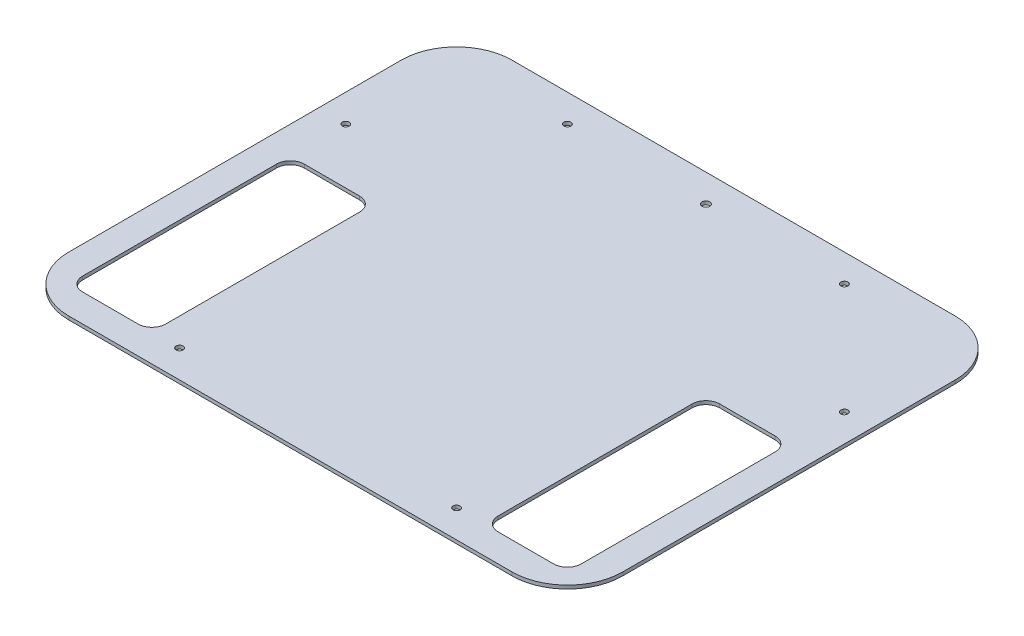
ISO-10303-21;
HEADER;
FILE_DESCRIPTION(('STEP AP214'),'2;1');
FILE_NAME('part.step','',(''),(''),'','','');
FILE_SCHEMA(('AUTOMOTIVE_DESIGN { 1 0 10303 214 1 1 1 1 }'));
ENDSEC;
DATA;
#1=APPLICATION_CONTEXT('core data for automotive mechanical design processes');
#2=APPLICATION_PROTOCOL_DEFINITION('international standard','automotive_design',2000,#1);
#3=PRODUCT_CONTEXT('',#1,'mechanical');
#4=PRODUCT('Part','Part','',(#3));
#5=PRODUCT_RELATED_PRODUCT_CATEGORY('part','',(#4));
#6=PRODUCT_DEFINITION_FORMATION('','',#4);
#7=PRODUCT_DEFINITION_CONTEXT('part definition',#1,'design');
#8=PRODUCT_DEFINITION('design','',#6,#7);
#9=PRODUCT_DEFINITION_SHAPE('','',#8);
#10=(LENGTH_UNIT() NAMED_UNIT(*) SI_UNIT(.MILLI.,.METRE.));
#11=(NAMED_UNIT(*) PLANE_ANGLE_UNIT() SI_UNIT($,.RADIAN.));
#12=(NAMED_UNIT(*) SI_UNIT($,.STERADIAN.) SOLID_ANGLE_UNIT());
#13=UNCERTAINTY_MEASURE_WITH_UNIT(LENGTH_MEASURE(1.E-05),#10,'distance_accuracy_value','');
#14=(GEOMETRIC_REPRESENTATION_CONTEXT(3) GLOBAL_UNCERTAINTY_ASSIGNED_CONTEXT((#13)) GLOBAL_UNIT_ASSIGNED_CONTEXT((#10,
#11,#12)) REPRESENTATION_CONTEXT('',''));
#15=CARTESIAN_POINT('',(0.,0.,0.));
#16=DIRECTION('',(0.,0.,1.));
#17=DIRECTION('',(1.,0.,0.));
#18=AXIS2_PLACEMENT_3D('',#15,#16,#17);
#19=CARTESIAN_POINT('',(-254.,3.175,-203.2));
#20=DIRECTION('',(1.,0.,0.));
#21=DIRECTION('',(0.,0.,-1.));
#22=AXIS2_PLACEMENT_3D('',#19,#20,#21);
#23=PLANE('',#22);
#24=DIRECTION('',(0.,0.,1.));
#25=VECTOR('',#24,1.);
#26=CARTESIAN_POINT('',(-254.,3.175,-203.2));
#27=LINE('',#26,#25);
#28=CARTESIAN_POINT('',(-254.,3.175,-152.4));
#29=VERTEX_POINT('',#28);
#30=CARTESIAN_POINT('',(-254.,3.175,152.4));
#31=VERTEX_POINT('',#30);
#32=EDGE_CURVE('E218',#29,#31,#27,.T.);
#33=ORIENTED_EDGE('',*,*,#32,.F.);
#34=DIRECTION('',(0.,-1.,0.));
#35=VECTOR('',#34,1.);
#36=CARTESIAN_POINT('',(-254.,3.175,-152.4));
#37=LINE('',#36,#35);
#38=CARTESIAN_POINT('',(-254.,0.,-152.4));
#39=VERTEX_POINT('',#38);
#40=EDGE_CURVE('E203',#29,#39,#37,.T.);
#41=ORIENTED_EDGE('',*,*,#40,.T.);
#42=DIRECTION('',(0.,0.,1.));
#43=VECTOR('',#42,1.);
#44=CARTESIAN_POINT('',(-254.,0.,-203.2));
#45=LINE('',#44,#43);
#46=CARTESIAN_POINT('',(-254.,0.,152.4));
#47=VERTEX_POINT('',#46);
#48=EDGE_CURVE('E215',#39,#47,#45,.T.);
#49=ORIENTED_EDGE('',*,*,#48,.T.);
#50=DIRECTION('',(0.,-1.,0.));
#51=VECTOR('',#50,1.);
#52=CARTESIAN_POINT('',(-254.,3.175,152.4));
#53=LINE('',#52,#51);
#54=EDGE_CURVE('E220',#47,#31,#53,.F.);
#55=ORIENTED_EDGE('',*,*,#54,.T.);
#56=EDGE_LOOP('',(#33,#41,#49,#55));
#57=FACE_BOUND('',#56,.T.);
#58=ADVANCED_FACE('F35',(#57),#23,.F.);
#59=CARTESIAN_POINT('',(-254.,3.175,203.2));
#60=DIRECTION('',(0.,0.,-1.));
#61=DIRECTION('',(-1.,0.,0.));
#62=AXIS2_PLACEMENT_3D('',#59,#60,#61);
#63=PLANE('',#62);
#64=DIRECTION('',(1.,0.,0.));
#65=VECTOR('',#64,1.);
#66=CARTESIAN_POINT('',(-254.,0.,203.2));
#67=LINE('',#66,#65);
#68=CARTESIAN_POINT('',(-203.2,0.,203.2));
#69=VERTEX_POINT('',#68);
#70=CARTESIAN_POINT('',(203.2,0.,203.2));
#71=VERTEX_POINT('',#70);
#72=EDGE_CURVE('E224',#69,#71,#67,.T.);
#73=ORIENTED_EDGE('',*,*,#72,.T.);
#74=DIRECTION('',(0.,-1.,0.));
#75=VECTOR('',#74,1.);
#76=CARTESIAN_POINT('',(203.2,3.175,203.2));
#77=LINE('',#76,#75);
#78=CARTESIAN_POINT('',(203.2,3.175,203.2));
#79=VERTEX_POINT('',#78);
#80=EDGE_CURVE('E265',#71,#79,#77,.F.);
#81=ORIENTED_EDGE('',*,*,#80,.T.);
#82=DIRECTION('',(1.,0.,0.));
#83=VECTOR('',#82,1.);
#84=CARTESIAN_POINT('',(-254.,3.175,203.2));
#85=LINE('',#84,#83);
#86=CARTESIAN_POINT('',(-203.2,3.175,203.2));
#87=VERTEX_POINT('',#86);
#88=EDGE_CURVE('E396',#87,#79,#85,.T.);
#89=ORIENTED_EDGE('',*,*,#88,.F.);
#90=DIRECTION('',(0.,-1.,0.));
#91=VECTOR('',#90,1.);
#92=CARTESIAN_POINT('',(-203.2,3.175,203.2));
#93=LINE('',#92,#91);
#94=EDGE_CURVE('E262',#87,#69,#93,.T.);
#95=ORIENTED_EDGE('',*,*,#94,.T.);
#96=EDGE_LOOP('',(#73,#81,#89,#95));
#97=FACE_BOUND('',#96,.T.);
#98=ADVANCED_FACE('F421',(#97),#63,.F.);
#99=CARTESIAN_POINT('',(254.,3.175,-203.2));
#100=DIRECTION('',(-1.,0.,0.));
#101=DIRECTION('',(0.,0.,1.));
#102=AXIS2_PLACEMENT_3D('',#99,#100,#101);
#103=PLANE('',#102);
#104=DIRECTION('',(0.,0.,-1.));
#105=VECTOR('',#104,1.);
#106=CARTESIAN_POINT('',(254.,0.,-203.2));
#107=LINE('',#106,#105);
#108=CARTESIAN_POINT('',(254.,0.,152.4));
#109=VERTEX_POINT('',#108);
#110=CARTESIAN_POINT('',(254.,0.,-152.4));
#111=VERTEX_POINT('',#110);
#112=EDGE_CURVE('E228',#109,#111,#107,.T.);
#113=ORIENTED_EDGE('',*,*,#112,.T.);
#114=DIRECTION('',(0.,-1.,0.));
#115=VECTOR('',#114,1.);
#116=CARTESIAN_POINT('',(254.,3.175,-152.4));
#117=LINE('',#116,#115);
#118=CARTESIAN_POINT('',(254.,3.175,-152.4));
#119=VERTEX_POINT('',#118);
#120=EDGE_CURVE('E260',#111,#119,#117,.F.);
#121=ORIENTED_EDGE('',*,*,#120,.T.);
#122=DIRECTION('',(0.,0.,-1.));
#123=VECTOR('',#122,1.);
#124=CARTESIAN_POINT('',(254.,3.175,-203.2));
#125=LINE('',#124,#123);
#126=CARTESIAN_POINT('',(254.,3.175,152.4));
#127=VERTEX_POINT('',#126);
#128=EDGE_CURVE('E398',#127,#119,#125,.T.);
#129=ORIENTED_EDGE('',*,*,#128,.F.);
#130=DIRECTION('',(0.,-1.,0.));
#131=VECTOR('',#130,1.);
#132=CARTESIAN_POINT('',(254.,3.175,152.4));
#133=LINE('',#132,#131);
#134=EDGE_CURVE('E257',#127,#109,#133,.T.);
#135=ORIENTED_EDGE('',*,*,#134,.T.);
#136=EDGE_LOOP('',(#113,#121,#129,#135));
#137=FACE_BOUND('',#136,.T.);
#138=ADVANCED_FACE('F414',(#137),#103,.F.);
#139=CARTESIAN_POINT('',(-254.,3.175,-203.2));
#140=DIRECTION('',(0.,0.,1.));
#141=DIRECTION('',(1.,0.,0.));
#142=AXIS2_PLACEMENT_3D('',#139,#140,#141);
#143=PLANE('',#142);
#144=DIRECTION('',(-1.,0.,0.));
#145=VECTOR('',#144,1.);
#146=CARTESIAN_POINT('',(-254.,0.,-203.2));
#147=LINE('',#146,#145);
#148=CARTESIAN_POINT('',(203.2,0.,-203.2));
#149=VERTEX_POINT('',#148);
#150=CARTESIAN_POINT('',(-203.2,0.,-203.2));
#151=VERTEX_POINT('',#150);
#152=EDGE_CURVE('E239',#149,#151,#147,.T.);
#153=ORIENTED_EDGE('',*,*,#152,.T.);
#154=DIRECTION('',(0.,-1.,0.));
#155=VECTOR('',#154,1.);
#156=CARTESIAN_POINT('',(-203.2,3.175,-203.2));
#157=LINE('',#156,#155);
#158=CARTESIAN_POINT('',(-203.2,3.175,-203.2));
#159=VERTEX_POINT('',#158);
#160=EDGE_CURVE('E204',#151,#159,#157,.F.);
#161=ORIENTED_EDGE('',*,*,#160,.T.);
#162=DIRECTION('',(-1.,0.,0.));
#163=VECTOR('',#162,1.);
#164=CARTESIAN_POINT('',(-254.,3.175,-203.2));
#165=LINE('',#164,#163);
#166=CARTESIAN_POINT('',(203.2,3.175,-203.2));
#167=VERTEX_POINT('',#166);
#168=EDGE_CURVE('E234',#167,#159,#165,.T.);
#169=ORIENTED_EDGE('',*,*,#168,.F.);
#170=DIRECTION('',(0.,-1.,0.));
#171=VECTOR('',#170,1.);
#172=CARTESIAN_POINT('',(203.2,3.175,-203.2));
#173=LINE('',#172,#171);
#174=EDGE_CURVE('E209',#167,#149,#173,.T.);
#175=ORIENTED_EDGE('',*,*,#174,.T.);
#176=EDGE_LOOP('',(#153,#161,#169,#175));
#177=FACE_BOUND('',#176,.T.);
#178=ADVANCED_FACE('F408',(#177),#143,.F.);
#179=CARTESIAN_POINT('',(-254.,3.175,203.2));
#180=DIRECTION('',(0.,1.,0.));
#181=DIRECTION('',(0.,0.,1.));
#182=AXIS2_PLACEMENT_3D('',#179,#180,#181);
#183=PLANE('',#182);
#184=CARTESIAN_POINT('',(0.,3.175,-177.8));
#185=DIRECTION('',(0.,1.,0.));
#186=DIRECTION('',(0.,0.,1.));
#187=AXIS2_PLACEMENT_3D('',#184,#185,#186);
#188=CIRCLE('',#187,3.57844786961746);
#189=CARTESIAN_POINT('',(0.,3.175,-174.221552130383));
#190=VERTEX_POINT('',#189);
#191=EDGE_CURVE('E737',#190,#190,#188,.T.);
#192=ORIENTED_EDGE('',*,*,#191,.F.);
#193=EDGE_LOOP('',(#192));
#194=FACE_BOUND('',#193,.T.);
#195=CARTESIAN_POINT('',(-127.,3.175,-177.8));
#196=DIRECTION('',(0.,1.,0.));
#197=DIRECTION('',(0.,0.,1.));
#198=AXIS2_PLACEMENT_3D('',#195,#196,#197);
#199=CIRCLE('',#198,3.175);
#200=CARTESIAN_POINT('',(-127.,3.175,-174.625));
#201=VERTEX_POINT('',#200);
#202=EDGE_CURVE('E741',#201,#201,#199,.T.);
#203=ORIENTED_EDGE('',*,*,#202,.F.);
#204=EDGE_LOOP('',(#203));
#205=FACE_BOUND('',#204,.T.);
#206=CARTESIAN_POINT('',(127.,3.175,-177.8));
#207=DIRECTION('',(0.,1.,0.));
#208=DIRECTION('',(0.,0.,1.));
#209=AXIS2_PLACEMENT_3D('',#206,#207,#208);
#210=CIRCLE('',#209,3.17499999999998);
#211=CARTESIAN_POINT('',(127.,3.175,-174.625));
#212=VERTEX_POINT('',#211);
#213=EDGE_CURVE('E750',#212,#212,#210,.T.);
#214=ORIENTED_EDGE('',*,*,#213,.F.);
#215=EDGE_LOOP('',(#214));
#216=FACE_BOUND('',#215,.T.);
#217=CARTESIAN_POINT('',(228.6,3.175,-76.2));
#218=DIRECTION('',(0.,1.,0.));
#219=DIRECTION('',(0.,0.,1.));
#220=AXIS2_PLACEMENT_3D('',#217,#218,#219);
#221=CIRCLE('',#220,3.17499999999998);
#222=CARTESIAN_POINT('',(228.6,3.175,-73.025));
#223=VERTEX_POINT('',#222);
#224=EDGE_CURVE('E753',#223,#223,#221,.T.);
#225=ORIENTED_EDGE('',*,*,#224,.F.);
#226=EDGE_LOOP('',(#225));
#227=FACE_BOUND('',#226,.T.);
#228=CARTESIAN_POINT('',(-228.6,3.175,-76.2));
#229=DIRECTION('',(0.,1.,0.));
#230=DIRECTION('',(0.,0.,1.));
#231=AXIS2_PLACEMENT_3D('',#228,#229,#230);
#232=CIRCLE('',#231,3.17499999999998);
#233=CARTESIAN_POINT('',(-228.6,3.175,-73.025));
#234=VERTEX_POINT('',#233);
#235=EDGE_CURVE('E351',#234,#234,#232,.T.);
#236=ORIENTED_EDGE('',*,*,#235,.F.);
#237=EDGE_LOOP('',(#236));
#238=FACE_BOUND('',#237,.T.);
#239=CARTESIAN_POINT('',(-127.,3.175,177.8));
#240=DIRECTION('',(0.,1.,0.));
#241=DIRECTION('',(0.,0.,1.));
#242=AXIS2_PLACEMENT_3D('',#239,#240,#241);
#243=CIRCLE('',#242,3.175);
#244=CARTESIAN_POINT('',(-127.,3.175,180.975));
#245=VERTEX_POINT('',#244);
#246=EDGE_CURVE('E340',#245,#245,#243,.T.);
#247=ORIENTED_EDGE('',*,*,#246,.F.);
#248=EDGE_LOOP('',(#247));
#249=FACE_BOUND('',#248,.T.);
#250=CARTESIAN_POINT('',(127.,3.175,177.8));
#251=DIRECTION('',(0.,1.,0.));
#252=DIRECTION('',(0.,0.,1.));
#253=AXIS2_PLACEMENT_3D('',#250,#251,#252);
#254=CIRCLE('',#253,3.17499999999998);
#255=CARTESIAN_POINT('',(127.,3.175,180.975));
#256=VERTEX_POINT('',#255);
#257=EDGE_CURVE('E337',#256,#256,#254,.T.);
#258=ORIENTED_EDGE('',*,*,#257,.F.);
#259=EDGE_LOOP('',(#258));
#260=FACE_BOUND('',#259,.T.);
#261=DIRECTION('',(0.,0.,1.));
#262=VECTOR('',#261,1.);
#263=CARTESIAN_POINT('',(152.4,3.175,177.8));
#264=LINE('',#263,#262);
#265=CARTESIAN_POINT('',(152.4,3.175,-12.7));
#266=VERTEX_POINT('',#265);
#267=CARTESIAN_POINT('',(152.4,3.175,165.1));
#268=VERTEX_POINT('',#267);
#269=EDGE_CURVE('E336',#266,#268,#264,.T.);
#270=ORIENTED_EDGE('',*,*,#269,.F.);
#271=CARTESIAN_POINT('',(165.1,3.175,-12.7));
#272=DIRECTION('',(0.,1.,0.));
#273=DIRECTION('',(0.,0.,1.));
#274=AXIS2_PLACEMENT_3D('',#271,#272,#273);
#275=CIRCLE('',#274,12.7);
#276=CARTESIAN_POINT('',(165.1,3.175,-25.4));
#277=VERTEX_POINT('',#276);
#278=EDGE_CURVE('E326',#266,#277,#275,.F.);
#279=ORIENTED_EDGE('',*,*,#278,.T.);
#280=DIRECTION('',(-1.,0.,0.));
#281=VECTOR('',#280,1.);
#282=CARTESIAN_POINT('',(152.4,3.175,-25.4));
#283=LINE('',#282,#281);
#284=CARTESIAN_POINT('',(215.9,3.175,-25.4));
#285=VERTEX_POINT('',#284);
#286=EDGE_CURVE('E358',#285,#277,#283,.T.);
#287=ORIENTED_EDGE('',*,*,#286,.F.);
#288=CARTESIAN_POINT('',(215.9,3.175,-12.7));
#289=DIRECTION('',(0.,1.,0.));
#290=DIRECTION('',(0.,0.,1.));
#291=AXIS2_PLACEMENT_3D('',#288,#289,#290);
#292=CIRCLE('',#291,12.7);
#293=CARTESIAN_POINT('',(228.6,3.175,-12.7));
#294=VERTEX_POINT('',#293);
#295=EDGE_CURVE('E322',#285,#294,#292,.F.);
#296=ORIENTED_EDGE('',*,*,#295,.T.);
#297=DIRECTION('',(0.,0.,-1.));
#298=VECTOR('',#297,1.);
#299=CARTESIAN_POINT('',(228.6,3.175,177.8));
#300=LINE('',#299,#298);
#301=CARTESIAN_POINT('',(228.6,3.175,165.1));
#302=VERTEX_POINT('',#301);
#303=EDGE_CURVE('E371',#302,#294,#300,.T.);
#304=ORIENTED_EDGE('',*,*,#303,.F.);
#305=CARTESIAN_POINT('',(215.9,3.175,165.1));
#306=DIRECTION('',(0.,1.,0.));
#307=DIRECTION('',(0.,0.,1.));
#308=AXIS2_PLACEMENT_3D('',#305,#306,#307);
#309=CIRCLE('',#308,12.7);
#310=CARTESIAN_POINT('',(215.9,3.175,177.8));
#311=VERTEX_POINT('',#310);
#312=EDGE_CURVE('E44',#302,#311,#309,.F.);
#313=ORIENTED_EDGE('',*,*,#312,.T.);
#314=DIRECTION('',(1.,0.,0.));
#315=VECTOR('',#314,1.);
#316=CARTESIAN_POINT('',(152.4,3.175,177.8));
#317=LINE('',#316,#315);
#318=CARTESIAN_POINT('',(165.1,3.175,177.8));
#319=VERTEX_POINT('',#318);
#320=EDGE_CURVE('E369',#319,#311,#317,.T.);
#321=ORIENTED_EDGE('',*,*,#320,.F.);
#322=CARTESIAN_POINT('',(165.1,3.175,165.1));
#323=DIRECTION('',(0.,1.,0.));
#324=DIRECTION('',(0.,0.,1.));
#325=AXIS2_PLACEMENT_3D('',#322,#323,#324);
#326=CIRCLE('',#325,12.7);
#327=EDGE_CURVE('E330',#319,#268,#326,.F.);
#328=ORIENTED_EDGE('',*,*,#327,.T.);
#329=EDGE_LOOP('',(#270,#279,#287,#296,#304,#313,#321,#328));
#330=FACE_BOUND('',#329,.T.);
#331=DIRECTION('',(0.,0.,1.));
#332=VECTOR('',#331,1.);
#333=CARTESIAN_POINT('',(-228.6,3.175,177.8));
#334=LINE('',#333,#332);
#335=CARTESIAN_POINT('',(-228.6,3.175,-12.7));
#336=VERTEX_POINT('',#335);
#337=CARTESIAN_POINT('',(-228.6,3.175,165.1));
#338=VERTEX_POINT('',#337);
#339=EDGE_CURVE('E366',#336,#338,#334,.T.);
#340=ORIENTED_EDGE('',*,*,#339,.F.);
#341=CARTESIAN_POINT('',(-215.9,3.175,-12.7));
#342=DIRECTION('',(0.,1.,0.));
#343=DIRECTION('',(0.,0.,1.));
#344=AXIS2_PLACEMENT_3D('',#341,#342,#343);
#345=CIRCLE('',#344,12.7);
#346=CARTESIAN_POINT('',(-215.9,3.175,-25.4));
#347=VERTEX_POINT('',#346);
#348=EDGE_CURVE('E310',#336,#347,#345,.F.);
#349=ORIENTED_EDGE('',*,*,#348,.T.);
#350=DIRECTION('',(-1.,0.,0.));
#351=VECTOR('',#350,1.);
#352=CARTESIAN_POINT('',(-228.6,3.175,-25.4));
#353=LINE('',#352,#351);
#354=CARTESIAN_POINT('',(-165.1,3.175,-25.4));
#355=VERTEX_POINT('',#354);
#356=EDGE_CURVE('E380',#355,#347,#353,.T.);
#357=ORIENTED_EDGE('',*,*,#356,.F.);
#358=CARTESIAN_POINT('',(-165.1,3.175,-12.7));
#359=DIRECTION('',(0.,1.,0.));
#360=DIRECTION('',(0.,0.,1.));
#361=AXIS2_PLACEMENT_3D('',#358,#359,#360);
#362=CIRCLE('',#361,12.7);
#363=CARTESIAN_POINT('',(-152.4,3.175,-12.7));
#364=VERTEX_POINT('',#363);
#365=EDGE_CURVE('E306',#355,#364,#362,.F.);
#366=ORIENTED_EDGE('',*,*,#365,.T.);
#367=DIRECTION('',(0.,0.,-1.));
#368=VECTOR('',#367,1.);
#369=CARTESIAN_POINT('',(-152.4,3.175,177.8));
#370=LINE('',#369,#368);
#371=CARTESIAN_POINT('',(-152.4,3.175,165.1));
#372=VERTEX_POINT('',#371);
#373=EDGE_CURVE('E390',#372,#364,#370,.T.);
#374=ORIENTED_EDGE('',*,*,#373,.F.);
#375=CARTESIAN_POINT('',(-165.1,3.175,165.1));
#376=DIRECTION('',(0.,1.,0.));
#377=DIRECTION('',(0.,0.,1.));
#378=AXIS2_PLACEMENT_3D('',#375,#376,#377);
#379=CIRCLE('',#378,12.7);
#380=CARTESIAN_POINT('',(-165.1,3.175,177.8));
#381=VERTEX_POINT('',#380);
#382=EDGE_CURVE('E314',#372,#381,#379,.F.);
#383=ORIENTED_EDGE('',*,*,#382,.T.);
#384=DIRECTION('',(1.,0.,0.));
#385=VECTOR('',#384,1.);
#386=CARTESIAN_POINT('',(-228.6,3.175,177.8));
#387=LINE('',#386,#385);
#388=CARTESIAN_POINT('',(-215.9,3.175,177.8));
#389=VERTEX_POINT('',#388);
#390=EDGE_CURVE('E387',#389,#381,#387,.T.);
#391=ORIENTED_EDGE('',*,*,#390,.F.);
#392=CARTESIAN_POINT('',(-215.9,3.175,165.1));
#393=DIRECTION('',(0.,1.,0.));
#394=DIRECTION('',(0.,0.,1.));
#395=AXIS2_PLACEMENT_3D('',#392,#393,#394);
#396=CIRCLE('',#395,12.7);
#397=EDGE_CURVE('E318',#389,#338,#396,.F.);
#398=ORIENTED_EDGE('',*,*,#397,.T.);
#399=EDGE_LOOP('',(#340,#349,#357,#366,#374,#383,#391,#398));
#400=FACE_BOUND('',#399,.T.);
#401=ORIENTED_EDGE('',*,*,#168,.T.);
#402=CARTESIAN_POINT('',(-203.2,3.175,-152.4));
#403=DIRECTION('',(0.,1.,0.));
#404=DIRECTION('',(0.,0.,1.));
#405=AXIS2_PLACEMENT_3D('',#402,#403,#404);
#406=CIRCLE('',#405,50.8);
#407=EDGE_CURVE('E255',#159,#29,#406,.T.);
#408=ORIENTED_EDGE('',*,*,#407,.T.);
#409=ORIENTED_EDGE('',*,*,#32,.T.);
#410=CARTESIAN_POINT('',(-203.2,3.175,152.4));
#411=DIRECTION('',(0.,1.,0.));
#412=DIRECTION('',(0.,0.,1.));
#413=AXIS2_PLACEMENT_3D('',#410,#411,#412);
#414=CIRCLE('',#413,50.8);
#415=EDGE_CURVE('E249',#31,#87,#414,.T.);
#416=ORIENTED_EDGE('',*,*,#415,.T.);
#417=ORIENTED_EDGE('',*,*,#88,.T.);
#418=CARTESIAN_POINT('',(203.2,3.175,152.4));
#419=DIRECTION('',(0.,1.,0.));
#420=DIRECTION('',(0.,0.,1.));
#421=AXIS2_PLACEMENT_3D('',#418,#419,#420);
#422=CIRCLE('',#421,50.8);
#423=EDGE_CURVE('E251',#79,#127,#422,.T.);
#424=ORIENTED_EDGE('',*,*,#423,.T.);
#425=ORIENTED_EDGE('',*,*,#128,.T.);
#426=CARTESIAN_POINT('',(203.2,3.175,-152.4));
#427=DIRECTION('',(0.,1.,0.));
#428=DIRECTION('',(0.,0.,1.));
#429=AXIS2_PLACEMENT_3D('',#426,#427,#428);
#430=CIRCLE('',#429,50.8);
#431=EDGE_CURVE('E253',#119,#167,#430,.T.);
#432=ORIENTED_EDGE('',*,*,#431,.T.);
#433=EDGE_LOOP('',(#401,#408,#409,#416,#417,#424,#425,#432));
#434=FACE_BOUND('',#433,.T.);
#435=ADVANCED_FACE('F405',(#194,#205,#216,#227,#238,#249,#260,#330,#400,#434),#183,.T.);
#436=CARTESIAN_POINT('',(-254.,0.,203.2));
#437=DIRECTION('',(0.,1.,0.));
#438=DIRECTION('',(0.,0.,1.));
#439=AXIS2_PLACEMENT_3D('',#436,#437,#438);
#440=PLANE('',#439);
#441=CARTESIAN_POINT('',(0.,0.,-177.8));
#442=DIRECTION('',(0.,1.,0.));
#443=DIRECTION('',(0.,0.,1.));
#444=AXIS2_PLACEMENT_3D('',#441,#442,#443);
#445=CIRCLE('',#444,3.57844786961746);
#446=CARTESIAN_POINT('',(0.,0.,-174.221552130383));
#447=VERTEX_POINT('',#446);
#448=EDGE_CURVE('E740',#447,#447,#445,.F.);
#449=ORIENTED_EDGE('',*,*,#448,.F.);
#450=EDGE_LOOP('',(#449));
#451=FACE_BOUND('',#450,.T.);
#452=CARTESIAN_POINT('',(-127.,0.,-177.8));
#453=DIRECTION('',(0.,1.,0.));
#454=DIRECTION('',(0.,0.,1.));
#455=AXIS2_PLACEMENT_3D('',#452,#453,#454);
#456=CIRCLE('',#455,3.175);
#457=CARTESIAN_POINT('',(-127.,0.,-174.625));
#458=VERTEX_POINT('',#457);
#459=EDGE_CURVE('E744',#458,#458,#456,.T.);
#460=ORIENTED_EDGE('',*,*,#459,.T.);
#461=EDGE_LOOP('',(#460));
#462=FACE_BOUND('',#461,.T.);
#463=CARTESIAN_POINT('',(127.,0.,-177.8));
#464=DIRECTION('',(0.,1.,0.));
#465=DIRECTION('',(0.,0.,1.));
#466=AXIS2_PLACEMENT_3D('',#463,#464,#465);
#467=CIRCLE('',#466,3.17499999999998);
#468=CARTESIAN_POINT('',(127.,0.,-174.625));
#469=VERTEX_POINT('',#468);
#470=EDGE_CURVE('E39',#469,#469,#467,.T.);
#471=ORIENTED_EDGE('',*,*,#470,.T.);
#472=EDGE_LOOP('',(#471));
#473=FACE_BOUND('',#472,.T.);
#474=CARTESIAN_POINT('',(228.6,0.,-76.2));
#475=DIRECTION('',(0.,1.,0.));
#476=DIRECTION('',(0.,0.,1.));
#477=AXIS2_PLACEMENT_3D('',#474,#475,#476);
#478=CIRCLE('',#477,3.17499999999998);
#479=CARTESIAN_POINT('',(228.6,0.,-73.025));
#480=VERTEX_POINT('',#479);
#481=EDGE_CURVE('E756',#480,#480,#478,.T.);
#482=ORIENTED_EDGE('',*,*,#481,.T.);
#483=EDGE_LOOP('',(#482));
#484=FACE_BOUND('',#483,.T.);
#485=CARTESIAN_POINT('',(-228.6,0.,-76.2));
#486=DIRECTION('',(0.,1.,0.));
#487=DIRECTION('',(0.,0.,1.));
#488=AXIS2_PLACEMENT_3D('',#485,#486,#487);
#489=CIRCLE('',#488,3.17499999999998);
#490=CARTESIAN_POINT('',(-228.6,0.,-73.025));
#491=VERTEX_POINT('',#490);
#492=EDGE_CURVE('E346',#491,#491,#489,.T.);
#493=ORIENTED_EDGE('',*,*,#492,.T.);
#494=EDGE_LOOP('',(#493));
#495=FACE_BOUND('',#494,.T.);
#496=CARTESIAN_POINT('',(-127.,0.,177.8));
#497=DIRECTION('',(0.,1.,0.));
#498=DIRECTION('',(0.,0.,1.));
#499=AXIS2_PLACEMENT_3D('',#496,#497,#498);
#500=CIRCLE('',#499,3.175);
#501=CARTESIAN_POINT('',(-127.,0.,180.975));
#502=VERTEX_POINT('',#501);
#503=EDGE_CURVE('E338',#502,#502,#500,.T.);
#504=ORIENTED_EDGE('',*,*,#503,.T.);
#505=EDGE_LOOP('',(#504));
#506=FACE_BOUND('',#505,.T.);
#507=CARTESIAN_POINT('',(127.,0.,177.8));
#508=DIRECTION('',(0.,1.,0.));
#509=DIRECTION('',(0.,0.,1.));
#510=AXIS2_PLACEMENT_3D('',#507,#508,#509);
#511=CIRCLE('',#510,3.17499999999998);
#512=CARTESIAN_POINT('',(127.,0.,180.975));
#513=VERTEX_POINT('',#512);
#514=EDGE_CURVE('E334',#513,#513,#511,.T.);
#515=ORIENTED_EDGE('',*,*,#514,.T.);
#516=EDGE_LOOP('',(#515));
#517=FACE_BOUND('',#516,.T.);
#518=DIRECTION('',(0.,0.,-1.));
#519=VECTOR('',#518,1.);
#520=CARTESIAN_POINT('',(228.6,0.,177.8));
#521=LINE('',#520,#519);
#522=CARTESIAN_POINT('',(228.6,0.,165.1));
#523=VERTEX_POINT('',#522);
#524=CARTESIAN_POINT('',(228.6,0.,-12.7));
#525=VERTEX_POINT('',#524);
#526=EDGE_CURVE('E360',#523,#525,#521,.T.);
#527=ORIENTED_EDGE('',*,*,#526,.T.);
#528=CARTESIAN_POINT('',(215.9,0.,-12.7));
#529=DIRECTION('',(0.,1.,0.));
#530=DIRECTION('',(0.,0.,1.));
#531=AXIS2_PLACEMENT_3D('',#528,#529,#530);
#532=CIRCLE('',#531,12.7);
#533=CARTESIAN_POINT('',(215.9,0.,-25.4));
#534=VERTEX_POINT('',#533);
#535=EDGE_CURVE('E324',#525,#534,#532,.T.);
#536=ORIENTED_EDGE('',*,*,#535,.T.);
#537=DIRECTION('',(-1.,0.,0.));
#538=VECTOR('',#537,1.);
#539=CARTESIAN_POINT('',(152.4,0.,-25.4));
#540=LINE('',#539,#538);
#541=CARTESIAN_POINT('',(165.1,0.,-25.4));
#542=VERTEX_POINT('',#541);
#543=EDGE_CURVE('E363',#534,#542,#540,.T.);
#544=ORIENTED_EDGE('',*,*,#543,.T.);
#545=CARTESIAN_POINT('',(165.1,0.,-12.7));
#546=DIRECTION('',(0.,1.,0.));
#547=DIRECTION('',(0.,0.,1.));
#548=AXIS2_PLACEMENT_3D('',#545,#546,#547);
#549=CIRCLE('',#548,12.7);
#550=CARTESIAN_POINT('',(152.4,0.,-12.7));
#551=VERTEX_POINT('',#550);
#552=EDGE_CURVE('E328',#542,#551,#549,.T.);
#553=ORIENTED_EDGE('',*,*,#552,.T.);
#554=DIRECTION('',(0.,0.,1.));
#555=VECTOR('',#554,1.);
#556=CARTESIAN_POINT('',(152.4,0.,177.8));
#557=LINE('',#556,#555);
#558=CARTESIAN_POINT('',(152.4,0.,165.1));
#559=VERTEX_POINT('',#558);
#560=EDGE_CURVE('E355',#551,#559,#557,.T.);
#561=ORIENTED_EDGE('',*,*,#560,.T.);
#562=CARTESIAN_POINT('',(165.1,0.,165.1));
#563=DIRECTION('',(0.,1.,0.));
#564=DIRECTION('',(0.,0.,1.));
#565=AXIS2_PLACEMENT_3D('',#562,#563,#564);
#566=CIRCLE('',#565,12.7);
#567=CARTESIAN_POINT('',(165.1,0.,177.8));
#568=VERTEX_POINT('',#567);
#569=EDGE_CURVE('E59',#559,#568,#566,.T.);
#570=ORIENTED_EDGE('',*,*,#569,.T.);
#571=DIRECTION('',(1.,0.,0.));
#572=VECTOR('',#571,1.);
#573=CARTESIAN_POINT('',(152.4,0.,177.8));
#574=LINE('',#573,#572);
#575=CARTESIAN_POINT('',(215.9,0.,177.8));
#576=VERTEX_POINT('',#575);
#577=EDGE_CURVE('E357',#568,#576,#574,.T.);
#578=ORIENTED_EDGE('',*,*,#577,.T.);
#579=CARTESIAN_POINT('',(215.9,0.,165.1));
#580=DIRECTION('',(0.,1.,0.));
#581=DIRECTION('',(0.,0.,1.));
#582=AXIS2_PLACEMENT_3D('',#579,#580,#581);
#583=CIRCLE('',#582,12.7);
#584=EDGE_CURVE('E11',#576,#523,#583,.T.);
#585=ORIENTED_EDGE('',*,*,#584,.T.);
#586=EDGE_LOOP('',(#527,#536,#544,#553,#561,#570,#578,#585));
#587=FACE_BOUND('',#586,.T.);
#588=DIRECTION('',(0.,0.,-1.));
#589=VECTOR('',#588,1.);
#590=CARTESIAN_POINT('',(-152.4,0.,177.8));
#591=LINE('',#590,#589);
#592=CARTESIAN_POINT('',(-152.4,0.,165.1));
#593=VERTEX_POINT('',#592);
#594=CARTESIAN_POINT('',(-152.4,0.,-12.7));
#595=VERTEX_POINT('',#594);
#596=EDGE_CURVE('E231',#593,#595,#591,.T.);
#597=ORIENTED_EDGE('',*,*,#596,.T.);
#598=CARTESIAN_POINT('',(-165.1,0.,-12.7));
#599=DIRECTION('',(0.,1.,0.));
#600=DIRECTION('',(0.,0.,1.));
#601=AXIS2_PLACEMENT_3D('',#598,#599,#600);
#602=CIRCLE('',#601,12.7);
#603=CARTESIAN_POINT('',(-165.1,0.,-25.4));
#604=VERTEX_POINT('',#603);
#605=EDGE_CURVE('E308',#595,#604,#602,.T.);
#606=ORIENTED_EDGE('',*,*,#605,.T.);
#607=DIRECTION('',(-1.,0.,0.));
#608=VECTOR('',#607,1.);
#609=CARTESIAN_POINT('',(-228.6,0.,-25.4));
#610=LINE('',#609,#608);
#611=CARTESIAN_POINT('',(-215.9,0.,-25.4));
#612=VERTEX_POINT('',#611);
#613=EDGE_CURVE('E225',#604,#612,#610,.T.);
#614=ORIENTED_EDGE('',*,*,#613,.T.);
#615=CARTESIAN_POINT('',(-215.9,0.,-12.7));
#616=DIRECTION('',(0.,1.,0.));
#617=DIRECTION('',(0.,0.,1.));
#618=AXIS2_PLACEMENT_3D('',#615,#616,#617);
#619=CIRCLE('',#618,12.7);
#620=CARTESIAN_POINT('',(-228.6,0.,-12.7));
#621=VERTEX_POINT('',#620);
#622=EDGE_CURVE('E312',#612,#621,#619,.T.);
#623=ORIENTED_EDGE('',*,*,#622,.T.);
#624=DIRECTION('',(0.,0.,1.));
#625=VECTOR('',#624,1.);
#626=CARTESIAN_POINT('',(-228.6,0.,177.8));
#627=LINE('',#626,#625);
#628=CARTESIAN_POINT('',(-228.6,0.,165.1));
#629=VERTEX_POINT('',#628);
#630=EDGE_CURVE('E376',#621,#629,#627,.T.);
#631=ORIENTED_EDGE('',*,*,#630,.T.);
#632=CARTESIAN_POINT('',(-215.9,0.,165.1));
#633=DIRECTION('',(0.,1.,0.));
#634=DIRECTION('',(0.,0.,1.));
#635=AXIS2_PLACEMENT_3D('',#632,#633,#634);
#636=CIRCLE('',#635,12.7);
#637=CARTESIAN_POINT('',(-215.9,0.,177.8));
#638=VERTEX_POINT('',#637);
#639=EDGE_CURVE('E320',#629,#638,#636,.T.);
#640=ORIENTED_EDGE('',*,*,#639,.T.);
#641=DIRECTION('',(1.,0.,0.));
#642=VECTOR('',#641,1.);
#643=CARTESIAN_POINT('',(-228.6,0.,177.8));
#644=LINE('',#643,#642);
#645=CARTESIAN_POINT('',(-165.1,0.,177.8));
#646=VERTEX_POINT('',#645);
#647=EDGE_CURVE('E379',#638,#646,#644,.T.);
#648=ORIENTED_EDGE('',*,*,#647,.T.);
#649=CARTESIAN_POINT('',(-165.1,0.,165.1));
#650=DIRECTION('',(0.,1.,0.));
#651=DIRECTION('',(0.,0.,1.));
#652=AXIS2_PLACEMENT_3D('',#649,#650,#651);
#653=CIRCLE('',#652,12.7);
#654=EDGE_CURVE('E316',#646,#593,#653,.T.);
#655=ORIENTED_EDGE('',*,*,#654,.T.);
#656=EDGE_LOOP('',(#597,#606,#614,#623,#631,#640,#648,#655));
#657=FACE_BOUND('',#656,.T.);
#658=ORIENTED_EDGE('',*,*,#48,.F.);
#659=CARTESIAN_POINT('',(-203.2,0.,-152.4));
#660=DIRECTION('',(0.,1.,0.));
#661=DIRECTION('',(0.,0.,1.));
#662=AXIS2_PLACEMENT_3D('',#659,#660,#661);
#663=CIRCLE('',#662,50.8);
#664=EDGE_CURVE('E199',#39,#151,#663,.F.);
#665=ORIENTED_EDGE('',*,*,#664,.T.);
#666=ORIENTED_EDGE('',*,*,#152,.F.);
#667=CARTESIAN_POINT('',(203.2,0.,-152.4));
#668=DIRECTION('',(0.,1.,0.));
#669=DIRECTION('',(0.,0.,1.));
#670=AXIS2_PLACEMENT_3D('',#667,#668,#669);
#671=CIRCLE('',#670,50.8);
#672=EDGE_CURVE('E210',#149,#111,#671,.F.);
#673=ORIENTED_EDGE('',*,*,#672,.T.);
#674=ORIENTED_EDGE('',*,*,#112,.F.);
#675=CARTESIAN_POINT('',(203.2,0.,152.4));
#676=DIRECTION('',(0.,1.,0.));
#677=DIRECTION('',(0.,0.,1.));
#678=AXIS2_PLACEMENT_3D('',#675,#676,#677);
#679=CIRCLE('',#678,50.8);
#680=EDGE_CURVE('E243',#109,#71,#679,.F.);
#681=ORIENTED_EDGE('',*,*,#680,.T.);
#682=ORIENTED_EDGE('',*,*,#72,.F.);
#683=CARTESIAN_POINT('',(-203.2,0.,152.4));
#684=DIRECTION('',(0.,1.,0.));
#685=DIRECTION('',(0.,0.,1.));
#686=AXIS2_PLACEMENT_3D('',#683,#684,#685);
#687=CIRCLE('',#686,50.8);
#688=EDGE_CURVE('E219',#69,#47,#687,.F.);
#689=ORIENTED_EDGE('',*,*,#688,.T.);
#690=EDGE_LOOP('',(#658,#665,#666,#673,#674,#681,#682,#689));
#691=FACE_BOUND('',#690,.T.);
#692=ADVANCED_FACE('F222',(#451,#462,#473,#484,#495,#506,#517,#587,#657,#691),#440,.F.);
#693=CARTESIAN_POINT('',(-228.6,0.,177.8));
#694=DIRECTION('',(-1.,0.,0.));
#695=DIRECTION('',(0.,0.,1.));
#696=AXIS2_PLACEMENT_3D('',#693,#694,#695);
#697=PLANE('',#696);
#698=ORIENTED_EDGE('',*,*,#630,.F.);
#699=DIRECTION('',(0.,1.,0.));
#700=VECTOR('',#699,1.);
#701=CARTESIAN_POINT('',(-228.6,3.175,-12.7));
#702=LINE('',#701,#700);
#703=EDGE_CURVE('E279',#621,#336,#702,.T.);
#704=ORIENTED_EDGE('',*,*,#703,.T.);
#705=ORIENTED_EDGE('',*,*,#339,.T.);
#706=DIRECTION('',(0.,1.,0.));
#707=VECTOR('',#706,1.);
#708=CARTESIAN_POINT('',(-228.6,0.,165.1));
#709=LINE('',#708,#707);
#710=EDGE_CURVE('E277',#338,#629,#709,.F.);
#711=ORIENTED_EDGE('',*,*,#710,.T.);
#712=EDGE_LOOP('',(#698,#704,#705,#711));
#713=FACE_BOUND('',#712,.T.);
#714=ADVANCED_FACE('F469',(#713),#697,.F.);
#715=CARTESIAN_POINT('',(-228.6,0.,-25.4));
#716=DIRECTION('',(0.,0.,-1.));
#717=DIRECTION('',(-1.,0.,0.));
#718=AXIS2_PLACEMENT_3D('',#715,#716,#717);
#719=PLANE('',#718);
#720=ORIENTED_EDGE('',*,*,#613,.F.);
#721=DIRECTION('',(0.,1.,0.));
#722=VECTOR('',#721,1.);
#723=CARTESIAN_POINT('',(-165.1,3.175,-25.4));
#724=LINE('',#723,#722);
#725=EDGE_CURVE('E269',#604,#355,#724,.T.);
#726=ORIENTED_EDGE('',*,*,#725,.T.);
#727=ORIENTED_EDGE('',*,*,#356,.T.);
#728=DIRECTION('',(0.,1.,0.));
#729=VECTOR('',#728,1.);
#730=CARTESIAN_POINT('',(-215.9,0.,-25.4));
#731=LINE('',#730,#729);
#732=EDGE_CURVE('E267',#347,#612,#731,.F.);
#733=ORIENTED_EDGE('',*,*,#732,.T.);
#734=EDGE_LOOP('',(#720,#726,#727,#733));
#735=FACE_BOUND('',#734,.T.);
#736=ADVANCED_FACE('F474',(#735),#719,.F.);
#737=CARTESIAN_POINT('',(-152.4,0.,177.8));
#738=DIRECTION('',(1.,0.,0.));
#739=DIRECTION('',(0.,0.,-1.));
#740=AXIS2_PLACEMENT_3D('',#737,#738,#739);
#741=PLANE('',#740);
#742=ORIENTED_EDGE('',*,*,#373,.T.);
#743=DIRECTION('',(0.,1.,0.));
#744=VECTOR('',#743,1.);
#745=CARTESIAN_POINT('',(-152.4,0.,-12.7));
#746=LINE('',#745,#744);
#747=EDGE_CURVE('E275',#364,#595,#746,.F.);
#748=ORIENTED_EDGE('',*,*,#747,.T.);
#749=ORIENTED_EDGE('',*,*,#596,.F.);
#750=DIRECTION('',(0.,1.,0.));
#751=VECTOR('',#750,1.);
#752=CARTESIAN_POINT('',(-152.4,3.175,165.1));
#753=LINE('',#752,#751);
#754=EDGE_CURVE('E272',#593,#372,#753,.T.);
#755=ORIENTED_EDGE('',*,*,#754,.T.);
#756=EDGE_LOOP('',(#742,#748,#749,#755));
#757=FACE_BOUND('',#756,.T.);
#758=ADVANCED_FACE('F486',(#757),#741,.F.);
#759=CARTESIAN_POINT('',(-228.6,0.,177.8));
#760=DIRECTION('',(0.,0.,1.));
#761=DIRECTION('',(1.,0.,0.));
#762=AXIS2_PLACEMENT_3D('',#759,#760,#761);
#763=PLANE('',#762);
#764=ORIENTED_EDGE('',*,*,#390,.T.);
#765=DIRECTION('',(0.,1.,0.));
#766=VECTOR('',#765,1.);
#767=CARTESIAN_POINT('',(-165.1,0.,177.8));
#768=LINE('',#767,#766);
#769=EDGE_CURVE('E285',#381,#646,#768,.F.);
#770=ORIENTED_EDGE('',*,*,#769,.T.);
#771=ORIENTED_EDGE('',*,*,#647,.F.);
#772=DIRECTION('',(0.,1.,0.));
#773=VECTOR('',#772,1.);
#774=CARTESIAN_POINT('',(-215.9,3.175,177.8));
#775=LINE('',#774,#773);
#776=EDGE_CURVE('E282',#638,#389,#775,.T.);
#777=ORIENTED_EDGE('',*,*,#776,.T.);
#778=EDGE_LOOP('',(#764,#770,#771,#777));
#779=FACE_BOUND('',#778,.T.);
#780=ADVANCED_FACE('F496',(#779),#763,.F.);
#781=CARTESIAN_POINT('',(152.4,0.,177.8));
#782=DIRECTION('',(-1.,0.,0.));
#783=DIRECTION('',(0.,0.,1.));
#784=AXIS2_PLACEMENT_3D('',#781,#782,#783);
#785=PLANE('',#784);
#786=ORIENTED_EDGE('',*,*,#560,.F.);
#787=DIRECTION('',(0.,1.,0.));
#788=VECTOR('',#787,1.);
#789=CARTESIAN_POINT('',(152.4,3.175,-12.7));
#790=LINE('',#789,#788);
#791=EDGE_CURVE('E299',#551,#266,#790,.T.);
#792=ORIENTED_EDGE('',*,*,#791,.T.);
#793=ORIENTED_EDGE('',*,*,#269,.T.);
#794=DIRECTION('',(0.,1.,0.));
#795=VECTOR('',#794,1.);
#796=CARTESIAN_POINT('',(152.4,0.,165.1));
#797=LINE('',#796,#795);
#798=EDGE_CURVE('E297',#268,#559,#797,.F.);
#799=ORIENTED_EDGE('',*,*,#798,.T.);
#800=EDGE_LOOP('',(#786,#792,#793,#799));
#801=FACE_BOUND('',#800,.T.);
#802=ADVANCED_FACE('F506',(#801),#785,.F.);
#803=CARTESIAN_POINT('',(152.4,0.,-25.4));
#804=DIRECTION('',(0.,0.,-1.));
#805=DIRECTION('',(-1.,0.,0.));
#806=AXIS2_PLACEMENT_3D('',#803,#804,#805);
#807=PLANE('',#806);
#808=ORIENTED_EDGE('',*,*,#543,.F.);
#809=DIRECTION('',(0.,1.,0.));
#810=VECTOR('',#809,1.);
#811=CARTESIAN_POINT('',(215.9,3.175,-25.4));
#812=LINE('',#811,#810);
#813=EDGE_CURVE('E289',#534,#285,#812,.T.);
#814=ORIENTED_EDGE('',*,*,#813,.T.);
#815=ORIENTED_EDGE('',*,*,#286,.T.);
#816=DIRECTION('',(0.,1.,0.));
#817=VECTOR('',#816,1.);
#818=CARTESIAN_POINT('',(165.1,0.,-25.4));
#819=LINE('',#818,#817);
#820=EDGE_CURVE('E287',#277,#542,#819,.F.);
#821=ORIENTED_EDGE('',*,*,#820,.T.);
#822=EDGE_LOOP('',(#808,#814,#815,#821));
#823=FACE_BOUND('',#822,.T.);
#824=ADVANCED_FACE('F516',(#823),#807,.F.);
#825=CARTESIAN_POINT('',(228.6,0.,177.8));
#826=DIRECTION('',(1.,0.,0.));
#827=DIRECTION('',(0.,0.,-1.));
#828=AXIS2_PLACEMENT_3D('',#825,#826,#827);
#829=PLANE('',#828);
#830=ORIENTED_EDGE('',*,*,#303,.T.);
#831=DIRECTION('',(0.,1.,0.));
#832=VECTOR('',#831,1.);
#833=CARTESIAN_POINT('',(228.6,0.,-12.7));
#834=LINE('',#833,#832);
#835=EDGE_CURVE('E295',#294,#525,#834,.F.);
#836=ORIENTED_EDGE('',*,*,#835,.T.);
#837=ORIENTED_EDGE('',*,*,#526,.F.);
#838=DIRECTION('',(0.,1.,0.));
#839=VECTOR('',#838,1.);
#840=CARTESIAN_POINT('',(228.6,3.175,165.1));
#841=LINE('',#840,#839);
#842=EDGE_CURVE('E292',#523,#302,#841,.T.);
#843=ORIENTED_EDGE('',*,*,#842,.T.);
#844=EDGE_LOOP('',(#830,#836,#837,#843));
#845=FACE_BOUND('',#844,.T.);
#846=ADVANCED_FACE('F526',(#845),#829,.F.);
#847=CARTESIAN_POINT('',(152.4,0.,177.8));
#848=DIRECTION('',(0.,0.,1.));
#849=DIRECTION('',(1.,0.,0.));
#850=AXIS2_PLACEMENT_3D('',#847,#848,#849);
#851=PLANE('',#850);
#852=ORIENTED_EDGE('',*,*,#577,.F.);
#853=DIRECTION('',(0.,1.,0.));
#854=VECTOR('',#853,1.);
#855=CARTESIAN_POINT('',(165.1,3.175,177.8));
#856=LINE('',#855,#854);
#857=EDGE_CURVE('E303',#568,#319,#856,.T.);
#858=ORIENTED_EDGE('',*,*,#857,.T.);
#859=ORIENTED_EDGE('',*,*,#320,.T.);
#860=DIRECTION('',(0.,1.,0.));
#861=VECTOR('',#860,1.);
#862=CARTESIAN_POINT('',(215.9,0.,177.8));
#863=LINE('',#862,#861);
#864=EDGE_CURVE('E52',#311,#576,#863,.F.);
#865=ORIENTED_EDGE('',*,*,#864,.T.);
#866=EDGE_LOOP('',(#852,#858,#859,#865));
#867=FACE_BOUND('',#866,.T.);
#868=ADVANCED_FACE('F448',(#867),#851,.F.);
#869=CARTESIAN_POINT('',(-203.2,3.175,-152.4));
#870=DIRECTION('',(0.,-1.,0.));
#871=DIRECTION('',(0.,0.,-1.));
#872=AXIS2_PLACEMENT_3D('',#869,#870,#871);
#873=CYLINDRICAL_SURFACE('',#872,50.8);
#874=ORIENTED_EDGE('',*,*,#407,.F.);
#875=ORIENTED_EDGE('',*,*,#160,.F.);
#876=ORIENTED_EDGE('',*,*,#664,.F.);
#877=ORIENTED_EDGE('',*,*,#40,.F.);
#878=EDGE_LOOP('',(#874,#875,#876,#877));
#879=FACE_BOUND('',#878,.T.);
#880=ADVANCED_FACE('F202',(#879),#873,.T.);
#881=CARTESIAN_POINT('',(203.2,3.175,-152.4));
#882=DIRECTION('',(0.,-1.,0.));
#883=DIRECTION('',(0.,0.,-1.));
#884=AXIS2_PLACEMENT_3D('',#881,#882,#883);
#885=CYLINDRICAL_SURFACE('',#884,50.8);
#886=ORIENTED_EDGE('',*,*,#431,.F.);
#887=ORIENTED_EDGE('',*,*,#120,.F.);
#888=ORIENTED_EDGE('',*,*,#672,.F.);
#889=ORIENTED_EDGE('',*,*,#174,.F.);
#890=EDGE_LOOP('',(#886,#887,#888,#889));
#891=FACE_BOUND('',#890,.T.);
#892=ADVANCED_FACE('F410',(#891),#885,.T.);
#893=CARTESIAN_POINT('',(203.2,3.175,152.4));
#894=DIRECTION('',(0.,-1.,0.));
#895=DIRECTION('',(0.,0.,-1.));
#896=AXIS2_PLACEMENT_3D('',#893,#894,#895);
#897=CYLINDRICAL_SURFACE('',#896,50.8);
#898=ORIENTED_EDGE('',*,*,#423,.F.);
#899=ORIENTED_EDGE('',*,*,#80,.F.);
#900=ORIENTED_EDGE('',*,*,#680,.F.);
#901=ORIENTED_EDGE('',*,*,#134,.F.);
#902=EDGE_LOOP('',(#898,#899,#900,#901));
#903=FACE_BOUND('',#902,.T.);
#904=ADVANCED_FACE('F418',(#903),#897,.T.);
#905=CARTESIAN_POINT('',(-203.2,3.175,152.4));
#906=DIRECTION('',(0.,-1.,0.));
#907=DIRECTION('',(0.,0.,-1.));
#908=AXIS2_PLACEMENT_3D('',#905,#906,#907);
#909=CYLINDRICAL_SURFACE('',#908,50.8);
#910=ORIENTED_EDGE('',*,*,#415,.F.);
#911=ORIENTED_EDGE('',*,*,#54,.F.);
#912=ORIENTED_EDGE('',*,*,#688,.F.);
#913=ORIENTED_EDGE('',*,*,#94,.F.);
#914=EDGE_LOOP('',(#910,#911,#912,#913));
#915=FACE_BOUND('',#914,.T.);
#916=ADVANCED_FACE('F426',(#915),#909,.T.);
#917=CARTESIAN_POINT('',(-165.1,0.,-12.7));
#918=DIRECTION('',(0.,-1.,0.));
#919=DIRECTION('',(0.,0.,-1.));
#920=AXIS2_PLACEMENT_3D('',#917,#918,#919);
#921=CYLINDRICAL_SURFACE('',#920,12.7);
#922=ORIENTED_EDGE('',*,*,#605,.F.);
#923=ORIENTED_EDGE('',*,*,#747,.F.);
#924=ORIENTED_EDGE('',*,*,#365,.F.);
#925=ORIENTED_EDGE('',*,*,#725,.F.);
#926=EDGE_LOOP('',(#922,#923,#924,#925));
#927=FACE_BOUND('',#926,.T.);
#928=ADVANCED_FACE('F428',(#927),#921,.F.);
#929=CARTESIAN_POINT('',(-215.9,0.,-12.7));
#930=DIRECTION('',(0.,-1.,0.));
#931=DIRECTION('',(0.,0.,-1.));
#932=AXIS2_PLACEMENT_3D('',#929,#930,#931);
#933=CYLINDRICAL_SURFACE('',#932,12.7);
#934=ORIENTED_EDGE('',*,*,#622,.F.);
#935=ORIENTED_EDGE('',*,*,#732,.F.);
#936=ORIENTED_EDGE('',*,*,#348,.F.);
#937=ORIENTED_EDGE('',*,*,#703,.F.);
#938=EDGE_LOOP('',(#934,#935,#936,#937));
#939=FACE_BOUND('',#938,.T.);
#940=ADVANCED_FACE('F434',(#939),#933,.F.);
#941=CARTESIAN_POINT('',(-165.1,0.,165.1));
#942=DIRECTION('',(0.,-1.,0.));
#943=DIRECTION('',(0.,0.,-1.));
#944=AXIS2_PLACEMENT_3D('',#941,#942,#943);
#945=CYLINDRICAL_SURFACE('',#944,12.7);
#946=ORIENTED_EDGE('',*,*,#654,.F.);
#947=ORIENTED_EDGE('',*,*,#769,.F.);
#948=ORIENTED_EDGE('',*,*,#382,.F.);
#949=ORIENTED_EDGE('',*,*,#754,.F.);
#950=EDGE_LOOP('',(#946,#947,#948,#949));
#951=FACE_BOUND('',#950,.T.);
#952=ADVANCED_FACE('F558',(#951),#945,.F.);
#953=CARTESIAN_POINT('',(-215.9,0.,165.1));
#954=DIRECTION('',(0.,-1.,0.));
#955=DIRECTION('',(0.,0.,-1.));
#956=AXIS2_PLACEMENT_3D('',#953,#954,#955);
#957=CYLINDRICAL_SURFACE('',#956,12.7);
#958=ORIENTED_EDGE('',*,*,#639,.F.);
#959=ORIENTED_EDGE('',*,*,#710,.F.);
#960=ORIENTED_EDGE('',*,*,#397,.F.);
#961=ORIENTED_EDGE('',*,*,#776,.F.);
#962=EDGE_LOOP('',(#958,#959,#960,#961));
#963=FACE_BOUND('',#962,.T.);
#964=ADVANCED_FACE('F568',(#963),#957,.F.);
#965=CARTESIAN_POINT('',(215.9,0.,-12.7));
#966=DIRECTION('',(0.,-1.,0.));
#967=DIRECTION('',(0.,0.,-1.));
#968=AXIS2_PLACEMENT_3D('',#965,#966,#967);
#969=CYLINDRICAL_SURFACE('',#968,12.7);
#970=ORIENTED_EDGE('',*,*,#535,.F.);
#971=ORIENTED_EDGE('',*,*,#835,.F.);
#972=ORIENTED_EDGE('',*,*,#295,.F.);
#973=ORIENTED_EDGE('',*,*,#813,.F.);
#974=EDGE_LOOP('',(#970,#971,#972,#973));
#975=FACE_BOUND('',#974,.T.);
#976=ADVANCED_FACE('F578',(#975),#969,.F.);
#977=CARTESIAN_POINT('',(165.1,0.,-12.7));
#978=DIRECTION('',(0.,-1.,0.));
#979=DIRECTION('',(0.,0.,-1.));
#980=AXIS2_PLACEMENT_3D('',#977,#978,#979);
#981=CYLINDRICAL_SURFACE('',#980,12.7);
#982=ORIENTED_EDGE('',*,*,#552,.F.);
#983=ORIENTED_EDGE('',*,*,#820,.F.);
#984=ORIENTED_EDGE('',*,*,#278,.F.);
#985=ORIENTED_EDGE('',*,*,#791,.F.);
#986=EDGE_LOOP('',(#982,#983,#984,#985));
#987=FACE_BOUND('',#986,.T.);
#988=ADVANCED_FACE('F588',(#987),#981,.F.);
#989=CARTESIAN_POINT('',(165.1,0.,165.1));
#990=DIRECTION('',(0.,-1.,0.));
#991=DIRECTION('',(0.,0.,-1.));
#992=AXIS2_PLACEMENT_3D('',#989,#990,#991);
#993=CYLINDRICAL_SURFACE('',#992,12.7);
#994=ORIENTED_EDGE('',*,*,#569,.F.);
#995=ORIENTED_EDGE('',*,*,#798,.F.);
#996=ORIENTED_EDGE('',*,*,#327,.F.);
#997=ORIENTED_EDGE('',*,*,#857,.F.);
#998=EDGE_LOOP('',(#994,#995,#996,#997));
#999=FACE_BOUND('',#998,.T.);
#1000=ADVANCED_FACE('F598',(#999),#993,.F.);
#1001=CARTESIAN_POINT('',(215.9,0.,165.1));
#1002=DIRECTION('',(0.,-1.,0.));
#1003=DIRECTION('',(0.,0.,-1.));
#1004=AXIS2_PLACEMENT_3D('',#1001,#1002,#1003);
#1005=CYLINDRICAL_SURFACE('',#1004,12.7);
#1006=ORIENTED_EDGE('',*,*,#584,.F.);
#1007=ORIENTED_EDGE('',*,*,#864,.F.);
#1008=ORIENTED_EDGE('',*,*,#312,.F.);
#1009=ORIENTED_EDGE('',*,*,#842,.F.);
#1010=EDGE_LOOP('',(#1006,#1007,#1008,#1009));
#1011=FACE_BOUND('',#1010,.T.);
#1012=ADVANCED_FACE('F37',(#1011),#1005,.F.);
#1013=CARTESIAN_POINT('',(127.,3.175,177.8));
#1014=DIRECTION('',(0.,1.,0.));
#1015=DIRECTION('',(0.,0.,1.));
#1016=AXIS2_PLACEMENT_3D('',#1013,#1014,#1015);
#1017=CYLINDRICAL_SURFACE('',#1016,3.17499999999998);
#1018=ORIENTED_EDGE('',*,*,#257,.T.);
#1019=EDGE_LOOP('',(#1018));
#1020=FACE_BOUND('',#1019,.T.);
#1021=ORIENTED_EDGE('',*,*,#514,.F.);
#1022=EDGE_LOOP('',(#1021));
#1023=FACE_BOUND('',#1022,.T.);
#1024=ADVANCED_FACE('F616',(#1020,#1023),#1017,.F.);
#1025=CARTESIAN_POINT('',(-127.,3.175,177.8));
#1026=DIRECTION('',(0.,1.,0.));
#1027=DIRECTION('',(0.,0.,1.));
#1028=AXIS2_PLACEMENT_3D('',#1025,#1026,#1027);
#1029=CYLINDRICAL_SURFACE('',#1028,3.175);
#1030=ORIENTED_EDGE('',*,*,#246,.T.);
#1031=EDGE_LOOP('',(#1030));
#1032=FACE_BOUND('',#1031,.T.);
#1033=ORIENTED_EDGE('',*,*,#503,.F.);
#1034=EDGE_LOOP('',(#1033));
#1035=FACE_BOUND('',#1034,.T.);
#1036=ADVANCED_FACE('F625',(#1032,#1035),#1029,.F.);
#1037=CARTESIAN_POINT('',(-228.6,3.175,-76.2));
#1038=DIRECTION('',(0.,1.,0.));
#1039=DIRECTION('',(0.,0.,1.));
#1040=AXIS2_PLACEMENT_3D('',#1037,#1038,#1039);
#1041=CYLINDRICAL_SURFACE('',#1040,3.17499999999998);
#1042=ORIENTED_EDGE('',*,*,#235,.T.);
#1043=EDGE_LOOP('',(#1042));
#1044=FACE_BOUND('',#1043,.T.);
#1045=ORIENTED_EDGE('',*,*,#492,.F.);
#1046=EDGE_LOOP('',(#1045));
#1047=FACE_BOUND('',#1046,.T.);
#1048=ADVANCED_FACE('F635',(#1044,#1047),#1041,.F.);
#1049=CARTESIAN_POINT('',(228.6,3.175,-76.2));
#1050=DIRECTION('',(0.,1.,0.));
#1051=DIRECTION('',(0.,0.,1.));
#1052=AXIS2_PLACEMENT_3D('',#1049,#1050,#1051);
#1053=CYLINDRICAL_SURFACE('',#1052,3.17499999999998);
#1054=ORIENTED_EDGE('',*,*,#224,.T.);
#1055=EDGE_LOOP('',(#1054));
#1056=FACE_BOUND('',#1055,.T.);
#1057=ORIENTED_EDGE('',*,*,#481,.F.);
#1058=EDGE_LOOP('',(#1057));
#1059=FACE_BOUND('',#1058,.T.);
#1060=ADVANCED_FACE('F644',(#1056,#1059),#1053,.F.);
#1061=CARTESIAN_POINT('',(127.,3.175,-177.8));
#1062=DIRECTION('',(0.,1.,0.));
#1063=DIRECTION('',(0.,0.,1.));
#1064=AXIS2_PLACEMENT_3D('',#1061,#1062,#1063);
#1065=CYLINDRICAL_SURFACE('',#1064,3.17499999999998);
#1066=ORIENTED_EDGE('',*,*,#213,.T.);
#1067=EDGE_LOOP('',(#1066));
#1068=FACE_BOUND('',#1067,.T.);
#1069=ORIENTED_EDGE('',*,*,#470,.F.);
#1070=EDGE_LOOP('',(#1069));
#1071=FACE_BOUND('',#1070,.T.);
#1072=ADVANCED_FACE('F654',(#1068,#1071),#1065,.F.);
#1073=CARTESIAN_POINT('',(-127.,3.175,-177.8));
#1074=DIRECTION('',(0.,1.,0.));
#1075=DIRECTION('',(0.,0.,1.));
#1076=AXIS2_PLACEMENT_3D('',#1073,#1074,#1075);
#1077=CYLINDRICAL_SURFACE('',#1076,3.175);
#1078=ORIENTED_EDGE('',*,*,#202,.T.);
#1079=EDGE_LOOP('',(#1078));
#1080=FACE_BOUND('',#1079,.T.);
#1081=ORIENTED_EDGE('',*,*,#459,.F.);
#1082=EDGE_LOOP('',(#1081));
#1083=FACE_BOUND('',#1082,.T.);
#1084=ADVANCED_FACE('F664',(#1080,#1083),#1077,.F.);
#1085=CARTESIAN_POINT('',(0.,-0.00100000000000013,-177.8));
#1086=DIRECTION('',(0.,1.,0.));
#1087=DIRECTION('',(0.,0.,1.));
#1088=AXIS2_PLACEMENT_3D('',#1085,#1086,#1087);
#1089=CYLINDRICAL_SURFACE('',#1088,3.57844786961746);
#1090=ORIENTED_EDGE('',*,*,#191,.T.);
#1091=EDGE_LOOP('',(#1090));
#1092=FACE_BOUND('',#1091,.T.);
#1093=ORIENTED_EDGE('',*,*,#448,.T.);
#1094=EDGE_LOOP('',(#1093));
#1095=FACE_BOUND('',#1094,.T.);
#1096=ADVANCED_FACE('F674',(#1092,#1095),#1089,.F.);
#1097=CLOSED_SHELL('',(#58,#98,#138,#178,#435,#692,#714,#736,#758,#780,#802,#824,#846,#868,#880,
#892,#904,#916,#928,#940,#952,#964,#976,#988,#1000,#1012,#1024,#1036,#1048,#1060,#1072,#1084,#1096));
#1098=MANIFOLD_SOLID_BREP('B2',#1097);
#1099=ADVANCED_BREP_SHAPE_REPRESENTATION('',(#18,#1098),#14);
#1100=SHAPE_DEFINITION_REPRESENTATION(#9,#1099);
ENDSEC;
END-ISO-10303-21;
